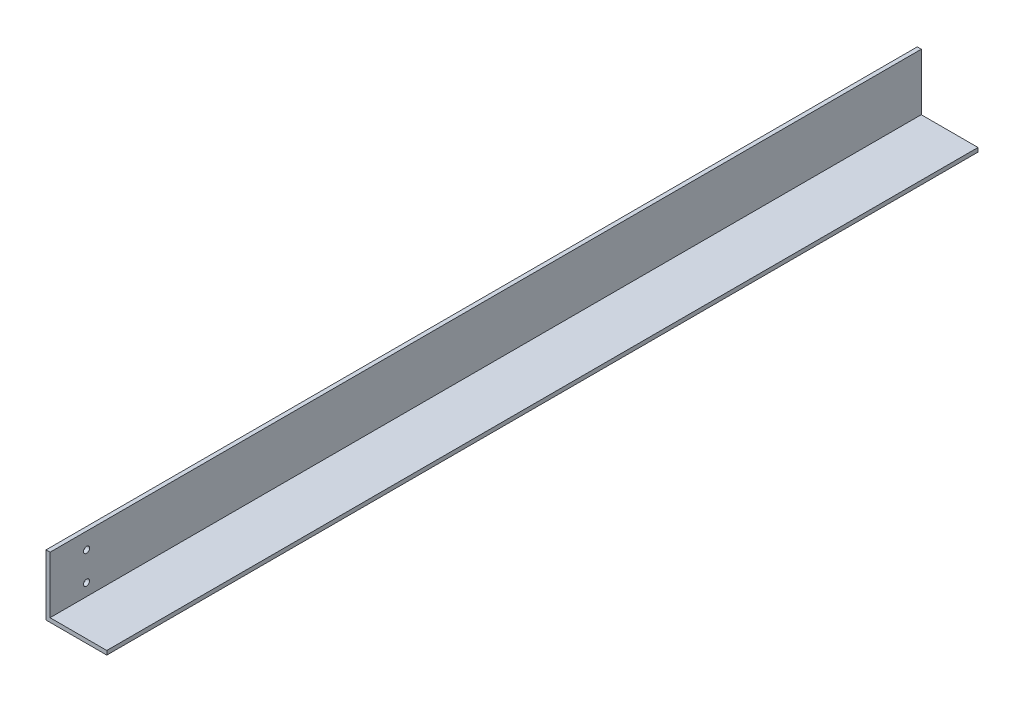
ISO-10303-21;
HEADER;
FILE_DESCRIPTION(('STEP AP214'),'2;1');
FILE_NAME('part.step','',(''),(''),'','','');
FILE_SCHEMA(('AUTOMOTIVE_DESIGN { 1 0 10303 214 1 1 1 1 }'));
ENDSEC;
DATA;
#1=APPLICATION_CONTEXT('core data for automotive mechanical design processes');
#2=APPLICATION_PROTOCOL_DEFINITION('international standard','automotive_design',2000,#1);
#3=PRODUCT_CONTEXT('',#1,'mechanical');
#4=PRODUCT('Part','Part','',(#3));
#5=PRODUCT_RELATED_PRODUCT_CATEGORY('part','',(#4));
#6=PRODUCT_DEFINITION_FORMATION('','',#4);
#7=PRODUCT_DEFINITION_CONTEXT('part definition',#1,'design');
#8=PRODUCT_DEFINITION('design','',#6,#7);
#9=PRODUCT_DEFINITION_SHAPE('','',#8);
#10=(LENGTH_UNIT() NAMED_UNIT(*) SI_UNIT(.MILLI.,.METRE.));
#11=(NAMED_UNIT(*) PLANE_ANGLE_UNIT() SI_UNIT($,.RADIAN.));
#12=(NAMED_UNIT(*) SI_UNIT($,.STERADIAN.) SOLID_ANGLE_UNIT());
#13=UNCERTAINTY_MEASURE_WITH_UNIT(LENGTH_MEASURE(1.E-05),#10,'distance_accuracy_value','');
#14=(GEOMETRIC_REPRESENTATION_CONTEXT(3) GLOBAL_UNCERTAINTY_ASSIGNED_CONTEXT((#13)) GLOBAL_UNIT_ASSIGNED_CONTEXT((#10,
#11,#12)) REPRESENTATION_CONTEXT('',''));
#15=CARTESIAN_POINT('',(0.,0.,0.));
#16=DIRECTION('',(0.,0.,1.));
#17=DIRECTION('',(1.,0.,0.));
#18=AXIS2_PLACEMENT_3D('',#15,#16,#17);
#19=CARTESIAN_POINT('',(30.,5.60231842899837,-19.999999999968));
#20=DIRECTION('',(0.,-1.,0.));
#21=DIRECTION('',(1.,0.,0.));
#22=AXIS2_PLACEMENT_3D('',#19,#20,#21);
#23=PLANE('',#22);
#24=DIRECTION('',(0.,0.,1.));
#25=VECTOR('',#24,1.);
#26=CARTESIAN_POINT('',(30.,5.60231842899837,-19.999999999968));
#27=LINE('',#26,#25);
#28=CARTESIAN_POINT('',(30.,5.60231842899837,-19.999999999968));
#29=VERTEX_POINT('',#28);
#30=CARTESIAN_POINT('',(30.,5.60231842899837,410.));
#31=VERTEX_POINT('',#30);
#32=EDGE_CURVE('E87',#29,#31,#27,.T.);
#33=ORIENTED_EDGE('',*,*,#32,.T.);
#34=DIRECTION('',(1.,0.,0.));
#35=VECTOR('',#34,1.);
#36=CARTESIAN_POINT('',(30.,5.60231842899837,410.));
#37=LINE('',#36,#35);
#38=CARTESIAN_POINT('',(0.,5.60231842899837,410.));
#39=VERTEX_POINT('',#38);
#40=EDGE_CURVE('E90',#39,#31,#37,.T.);
#41=ORIENTED_EDGE('',*,*,#40,.F.);
#42=DIRECTION('',(0.,0.,1.));
#43=VECTOR('',#42,1.);
#44=CARTESIAN_POINT('',(0.,5.60231842899837,-19.999999999968));
#45=LINE('',#44,#43);
#46=CARTESIAN_POINT('',(0.,5.60231842899837,-19.999999999968));
#47=VERTEX_POINT('',#46);
#48=EDGE_CURVE('E11',#47,#39,#45,.T.);
#49=ORIENTED_EDGE('',*,*,#48,.F.);
#50=DIRECTION('',(1.,0.,0.));
#51=VECTOR('',#50,1.);
#52=CARTESIAN_POINT('',(30.,5.60231842899837,-19.999999999968));
#53=LINE('',#52,#51);
#54=EDGE_CURVE('E91',#47,#29,#53,.T.);
#55=ORIENTED_EDGE('',*,*,#54,.T.);
#56=EDGE_LOOP('',(#33,#41,#49,#55));
#57=FACE_BOUND('',#56,.T.);
#58=ADVANCED_FACE('F37',(#57),#23,.T.);
#59=CARTESIAN_POINT('',(0.,5.60231842899837,-19.999999999968));
#60=DIRECTION('',(-1.,0.,0.));
#61=DIRECTION('',(0.,0.,1.));
#62=AXIS2_PLACEMENT_3D('',#59,#60,#61);
#63=PLANE('',#62);
#64=CARTESIAN_POINT('',(0.,13.6023184289984,391.999999999789));
#65=DIRECTION('',(-1.,0.,0.));
#66=DIRECTION('',(0.,0.,1.));
#67=AXIS2_PLACEMENT_3D('',#64,#65,#66);
#68=CIRCLE('',#67,1.49999999999999);
#69=CARTESIAN_POINT('',(0.,13.6023184289984,393.499999999789));
#70=VERTEX_POINT('',#69);
#71=EDGE_CURVE('E195',#70,#70,#68,.T.);
#72=ORIENTED_EDGE('',*,*,#71,.F.);
#73=EDGE_LOOP('',(#72));
#74=FACE_BOUND('',#73,.T.);
#75=CARTESIAN_POINT('',(0.,27.6023184289984,391.999999999789));
#76=DIRECTION('',(-1.,0.,0.));
#77=DIRECTION('',(0.,0.,1.));
#78=AXIS2_PLACEMENT_3D('',#75,#76,#77);
#79=CIRCLE('',#78,1.49999999999999);
#80=CARTESIAN_POINT('',(0.,27.6023184289984,393.499999999789));
#81=VERTEX_POINT('',#80);
#82=EDGE_CURVE('E112',#81,#81,#79,.T.);
#83=ORIENTED_EDGE('',*,*,#82,.F.);
#84=EDGE_LOOP('',(#83));
#85=FACE_BOUND('',#84,.T.);
#86=ORIENTED_EDGE('',*,*,#48,.T.);
#87=DIRECTION('',(0.,-1.,0.));
#88=VECTOR('',#87,1.);
#89=CARTESIAN_POINT('',(0.,5.60231842899837,410.));
#90=LINE('',#89,#88);
#91=CARTESIAN_POINT('',(0.,35.6023184289984,410.));
#92=VERTEX_POINT('',#91);
#93=EDGE_CURVE('E108',#92,#39,#90,.T.);
#94=ORIENTED_EDGE('',*,*,#93,.F.);
#95=DIRECTION('',(0.,0.,1.));
#96=VECTOR('',#95,1.);
#97=CARTESIAN_POINT('',(0.,35.6023184289984,-19.999999999968));
#98=LINE('',#97,#96);
#99=CARTESIAN_POINT('',(0.,35.6023184289984,-19.999999999968));
#100=VERTEX_POINT('',#99);
#101=EDGE_CURVE('E45',#100,#92,#98,.T.);
#102=ORIENTED_EDGE('',*,*,#101,.F.);
#103=DIRECTION('',(0.,-1.,0.));
#104=VECTOR('',#103,1.);
#105=CARTESIAN_POINT('',(0.,5.60231842899837,-19.999999999968));
#106=LINE('',#105,#104);
#107=EDGE_CURVE('E96',#100,#47,#106,.T.);
#108=ORIENTED_EDGE('',*,*,#107,.T.);
#109=EDGE_LOOP('',(#86,#94,#102,#108));
#110=FACE_BOUND('',#109,.T.);
#111=ADVANCED_FACE('F154',(#74,#85,#110),#63,.T.);
#112=CARTESIAN_POINT('',(0.,35.6023184289984,-19.999999999968));
#113=DIRECTION('',(0.,1.,0.));
#114=DIRECTION('',(0.,0.,1.));
#115=AXIS2_PLACEMENT_3D('',#112,#113,#114);
#116=PLANE('',#115);
#117=ORIENTED_EDGE('',*,*,#101,.T.);
#118=DIRECTION('',(-1.,0.,0.));
#119=VECTOR('',#118,1.);
#120=CARTESIAN_POINT('',(0.,35.6023184289984,410.));
#121=LINE('',#120,#119);
#122=CARTESIAN_POINT('',(2.,35.6023184289984,410.));
#123=VERTEX_POINT('',#122);
#124=EDGE_CURVE('E120',#123,#92,#121,.T.);
#125=ORIENTED_EDGE('',*,*,#124,.F.);
#126=DIRECTION('',(0.,0.,1.));
#127=VECTOR('',#126,1.);
#128=CARTESIAN_POINT('',(2.,35.6023184289984,-19.999999999968));
#129=LINE('',#128,#127);
#130=CARTESIAN_POINT('',(2.,35.6023184289984,-19.999999999968));
#131=VERTEX_POINT('',#130);
#132=EDGE_CURVE('E136',#131,#123,#129,.T.);
#133=ORIENTED_EDGE('',*,*,#132,.F.);
#134=DIRECTION('',(-1.,0.,0.));
#135=VECTOR('',#134,1.);
#136=CARTESIAN_POINT('',(0.,35.6023184289984,-19.999999999968));
#137=LINE('',#136,#135);
#138=EDGE_CURVE('E132',#131,#100,#137,.T.);
#139=ORIENTED_EDGE('',*,*,#138,.T.);
#140=EDGE_LOOP('',(#117,#125,#133,#139));
#141=FACE_BOUND('',#140,.T.);
#142=ADVANCED_FACE('F150',(#141),#116,.T.);
#143=CARTESIAN_POINT('',(2.,35.6023184289984,-19.999999999968));
#144=DIRECTION('',(1.,0.,0.));
#145=DIRECTION('',(0.,1.,0.));
#146=AXIS2_PLACEMENT_3D('',#143,#144,#145);
#147=PLANE('',#146);
#148=CARTESIAN_POINT('',(2.,13.6023184289984,391.999999999789));
#149=DIRECTION('',(1.,0.,0.));
#150=DIRECTION('',(0.,1.,0.));
#151=AXIS2_PLACEMENT_3D('',#148,#149,#150);
#152=CIRCLE('',#151,1.49999999999999);
#153=CARTESIAN_POINT('',(2.,15.1023184289984,391.999999999789));
#154=VERTEX_POINT('',#153);
#155=EDGE_CURVE('E40',#154,#154,#152,.T.);
#156=ORIENTED_EDGE('',*,*,#155,.F.);
#157=EDGE_LOOP('',(#156));
#158=FACE_BOUND('',#157,.T.);
#159=CARTESIAN_POINT('',(2.,27.6023184289984,391.999999999789));
#160=DIRECTION('',(1.,0.,0.));
#161=DIRECTION('',(0.,1.,0.));
#162=AXIS2_PLACEMENT_3D('',#159,#160,#161);
#163=CIRCLE('',#162,1.49999999999999);
#164=CARTESIAN_POINT('',(2.,29.1023184289984,391.999999999789));
#165=VERTEX_POINT('',#164);
#166=EDGE_CURVE('E109',#165,#165,#163,.T.);
#167=ORIENTED_EDGE('',*,*,#166,.F.);
#168=EDGE_LOOP('',(#167));
#169=FACE_BOUND('',#168,.T.);
#170=ORIENTED_EDGE('',*,*,#132,.T.);
#171=DIRECTION('',(0.,1.,0.));
#172=VECTOR('',#171,1.);
#173=CARTESIAN_POINT('',(2.,35.6023184289984,410.));
#174=LINE('',#173,#172);
#175=CARTESIAN_POINT('',(2.,7.60231842899837,410.));
#176=VERTEX_POINT('',#175);
#177=EDGE_CURVE('E117',#176,#123,#174,.T.);
#178=ORIENTED_EDGE('',*,*,#177,.F.);
#179=DIRECTION('',(0.,0.,1.));
#180=VECTOR('',#179,1.);
#181=CARTESIAN_POINT('',(2.,7.60231842899837,-19.999999999968));
#182=LINE('',#181,#180);
#183=CARTESIAN_POINT('',(2.,7.60231842899837,-19.999999999968));
#184=VERTEX_POINT('',#183);
#185=EDGE_CURVE('E138',#184,#176,#182,.T.);
#186=ORIENTED_EDGE('',*,*,#185,.F.);
#187=DIRECTION('',(0.,1.,0.));
#188=VECTOR('',#187,1.);
#189=CARTESIAN_POINT('',(2.,35.6023184289984,-19.999999999968));
#190=LINE('',#189,#188);
#191=EDGE_CURVE('E129',#184,#131,#190,.T.);
#192=ORIENTED_EDGE('',*,*,#191,.T.);
#193=EDGE_LOOP('',(#170,#178,#186,#192));
#194=FACE_BOUND('',#193,.T.);
#195=ADVANCED_FACE('F147',(#158,#169,#194),#147,.T.);
#196=CARTESIAN_POINT('',(2.,7.60231842899837,-19.999999999968));
#197=DIRECTION('',(0.,1.,0.));
#198=DIRECTION('',(0.,0.,1.));
#199=AXIS2_PLACEMENT_3D('',#196,#197,#198);
#200=PLANE('',#199);
#201=ORIENTED_EDGE('',*,*,#185,.T.);
#202=DIRECTION('',(-1.,0.,0.));
#203=VECTOR('',#202,1.);
#204=CARTESIAN_POINT('',(2.,7.60231842899837,410.));
#205=LINE('',#204,#203);
#206=CARTESIAN_POINT('',(30.,7.60231842899837,410.));
#207=VERTEX_POINT('',#206);
#208=EDGE_CURVE('E103',#207,#176,#205,.T.);
#209=ORIENTED_EDGE('',*,*,#208,.F.);
#210=DIRECTION('',(0.,0.,1.));
#211=VECTOR('',#210,1.);
#212=CARTESIAN_POINT('',(30.,7.60231842899837,-19.999999999968));
#213=LINE('',#212,#211);
#214=CARTESIAN_POINT('',(30.,7.60231842899837,-19.999999999968));
#215=VERTEX_POINT('',#214);
#216=EDGE_CURVE('E95',#215,#207,#213,.T.);
#217=ORIENTED_EDGE('',*,*,#216,.F.);
#218=DIRECTION('',(-1.,0.,0.));
#219=VECTOR('',#218,1.);
#220=CARTESIAN_POINT('',(2.,7.60231842899837,-19.999999999968));
#221=LINE('',#220,#219);
#222=EDGE_CURVE('E126',#215,#184,#221,.T.);
#223=ORIENTED_EDGE('',*,*,#222,.T.);
#224=EDGE_LOOP('',(#201,#209,#217,#223));
#225=FACE_BOUND('',#224,.T.);
#226=ADVANCED_FACE('F141',(#225),#200,.T.);
#227=CARTESIAN_POINT('',(30.,7.60231842899837,-19.999999999968));
#228=DIRECTION('',(1.,0.,0.));
#229=DIRECTION('',(0.,0.,-1.));
#230=AXIS2_PLACEMENT_3D('',#227,#228,#229);
#231=PLANE('',#230);
#232=ORIENTED_EDGE('',*,*,#216,.T.);
#233=DIRECTION('',(0.,1.,0.));
#234=VECTOR('',#233,1.);
#235=CARTESIAN_POINT('',(30.,7.60231842899837,410.));
#236=LINE('',#235,#234);
#237=EDGE_CURVE('E98',#31,#207,#236,.T.);
#238=ORIENTED_EDGE('',*,*,#237,.F.);
#239=ORIENTED_EDGE('',*,*,#32,.F.);
#240=DIRECTION('',(0.,1.,0.));
#241=VECTOR('',#240,1.);
#242=CARTESIAN_POINT('',(30.,7.60231842899837,-19.999999999968));
#243=LINE('',#242,#241);
#244=EDGE_CURVE('E124',#29,#215,#243,.T.);
#245=ORIENTED_EDGE('',*,*,#244,.T.);
#246=EDGE_LOOP('',(#232,#238,#239,#245));
#247=FACE_BOUND('',#246,.T.);
#248=ADVANCED_FACE('F99',(#247),#231,.T.);
#249=CARTESIAN_POINT('',(0.,0.,-19.999999999968));
#250=DIRECTION('',(0.,0.,-1.));
#251=DIRECTION('',(-1.,0.,0.));
#252=AXIS2_PLACEMENT_3D('',#249,#250,#251);
#253=PLANE('',#252);
#254=ORIENTED_EDGE('',*,*,#54,.F.);
#255=ORIENTED_EDGE('',*,*,#107,.F.);
#256=ORIENTED_EDGE('',*,*,#138,.F.);
#257=ORIENTED_EDGE('',*,*,#191,.F.);
#258=ORIENTED_EDGE('',*,*,#222,.F.);
#259=ORIENTED_EDGE('',*,*,#244,.F.);
#260=EDGE_LOOP('',(#254,#255,#256,#257,#258,#259));
#261=FACE_BOUND('',#260,.T.);
#262=ADVANCED_FACE('F153',(#261),#253,.T.);
#263=CARTESIAN_POINT('',(0.,0.,410.));
#264=DIRECTION('',(0.,0.,-1.));
#265=DIRECTION('',(-1.,0.,0.));
#266=AXIS2_PLACEMENT_3D('',#263,#264,#265);
#267=PLANE('',#266);
#268=ORIENTED_EDGE('',*,*,#40,.T.);
#269=ORIENTED_EDGE('',*,*,#237,.T.);
#270=ORIENTED_EDGE('',*,*,#208,.T.);
#271=ORIENTED_EDGE('',*,*,#177,.T.);
#272=ORIENTED_EDGE('',*,*,#124,.T.);
#273=ORIENTED_EDGE('',*,*,#93,.T.);
#274=EDGE_LOOP('',(#268,#269,#270,#271,#272,#273));
#275=FACE_BOUND('',#274,.T.);
#276=ADVANCED_FACE('F106',(#275),#267,.F.);
#277=CARTESIAN_POINT('',(0.,27.6023184289984,391.999999999789));
#278=DIRECTION('',(-1.,0.,0.));
#279=DIRECTION('',(0.,0.,1.));
#280=AXIS2_PLACEMENT_3D('',#277,#278,#279);
#281=CYLINDRICAL_SURFACE('',#280,1.49999999999999);
#282=ORIENTED_EDGE('',*,*,#166,.T.);
#283=EDGE_LOOP('',(#282));
#284=FACE_BOUND('',#283,.T.);
#285=ORIENTED_EDGE('',*,*,#82,.T.);
#286=EDGE_LOOP('',(#285));
#287=FACE_BOUND('',#286,.T.);
#288=ADVANCED_FACE('F180',(#284,#287),#281,.F.);
#289=CARTESIAN_POINT('',(0.,13.6023184289984,391.999999999789));
#290=DIRECTION('',(-1.,0.,0.));
#291=DIRECTION('',(0.,0.,1.));
#292=AXIS2_PLACEMENT_3D('',#289,#290,#291);
#293=CYLINDRICAL_SURFACE('',#292,1.49999999999999);
#294=ORIENTED_EDGE('',*,*,#155,.T.);
#295=EDGE_LOOP('',(#294));
#296=FACE_BOUND('',#295,.T.);
#297=ORIENTED_EDGE('',*,*,#71,.T.);
#298=EDGE_LOOP('',(#297));
#299=FACE_BOUND('',#298,.T.);
#300=ADVANCED_FACE('F183',(#296,#299),#293,.F.);
#301=CLOSED_SHELL('',(#58,#111,#142,#195,#226,#248,#262,#276,#288,#300));
#302=MANIFOLD_SOLID_BREP('B2',#301);
#303=ADVANCED_BREP_SHAPE_REPRESENTATION('',(#18,#302),#14);
#304=SHAPE_DEFINITION_REPRESENTATION(#9,#303);
ENDSEC;
END-ISO-10303-21;
